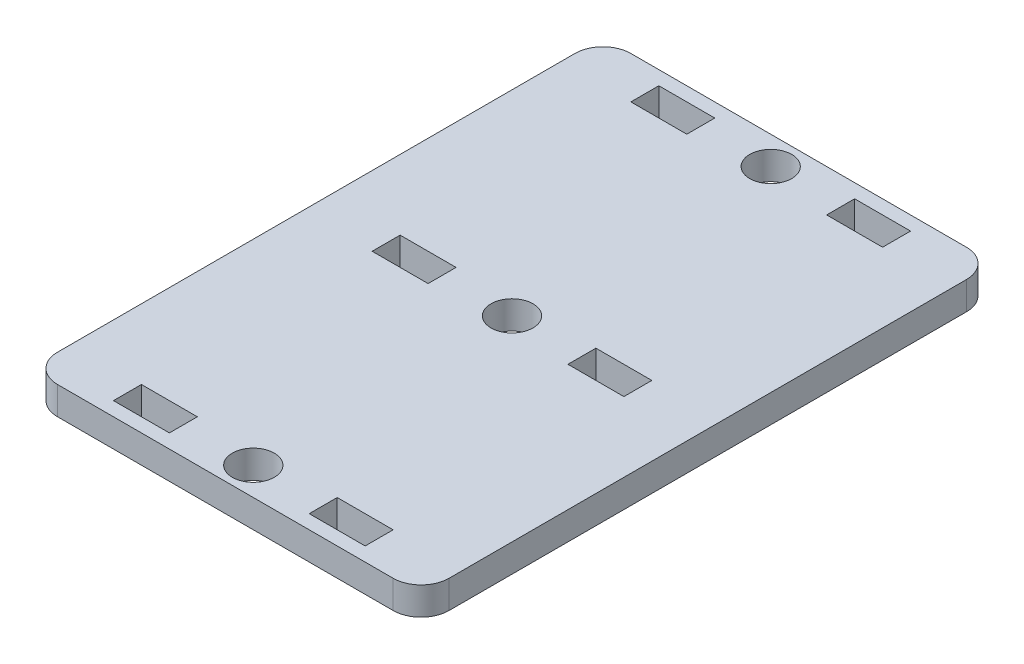
ISO-10303-21;
HEADER;
FILE_DESCRIPTION(('STEP AP214'),'2;1');
FILE_NAME('part.step','',(''),(''),'','','');
FILE_SCHEMA(('AUTOMOTIVE_DESIGN { 1 0 10303 214 1 1 1 1 }'));
ENDSEC;
DATA;
#1=APPLICATION_CONTEXT('core data for automotive mechanical design processes');
#2=APPLICATION_PROTOCOL_DEFINITION('international standard','automotive_design',2000,#1);
#3=PRODUCT_CONTEXT('',#1,'mechanical');
#4=PRODUCT('Part','Part','',(#3));
#5=PRODUCT_RELATED_PRODUCT_CATEGORY('part','',(#4));
#6=PRODUCT_DEFINITION_FORMATION('','',#4);
#7=PRODUCT_DEFINITION_CONTEXT('part definition',#1,'design');
#8=PRODUCT_DEFINITION('design','',#6,#7);
#9=PRODUCT_DEFINITION_SHAPE('','',#8);
#10=(LENGTH_UNIT() NAMED_UNIT(*) SI_UNIT(.MILLI.,.METRE.));
#11=(NAMED_UNIT(*) PLANE_ANGLE_UNIT() SI_UNIT($,.RADIAN.));
#12=(NAMED_UNIT(*) SI_UNIT($,.STERADIAN.) SOLID_ANGLE_UNIT());
#13=UNCERTAINTY_MEASURE_WITH_UNIT(LENGTH_MEASURE(1.E-05),#10,'distance_accuracy_value','');
#14=(GEOMETRIC_REPRESENTATION_CONTEXT(3) GLOBAL_UNCERTAINTY_ASSIGNED_CONTEXT((#13)) GLOBAL_UNIT_ASSIGNED_CONTEXT((#10,
#11,#12)) REPRESENTATION_CONTEXT('',''));
#15=CARTESIAN_POINT('',(0.,0.,0.));
#16=DIRECTION('',(0.,0.,1.));
#17=DIRECTION('',(1.,0.,0.));
#18=AXIS2_PLACEMENT_3D('',#15,#16,#17);
#19=CARTESIAN_POINT('',(0.,2.,0.));
#20=DIRECTION('',(0.,-1.,0.));
#21=DIRECTION('',(0.,0.,-1.));
#22=AXIS2_PLACEMENT_3D('',#19,#20,#21);
#23=PLANE('',#22);
#24=DIRECTION('',(0.,0.,1.));
#25=VECTOR('',#24,1.);
#26=CARTESIAN_POINT('',(42.5000000000015,2.,-9.25));
#27=LINE('',#26,#25);
#28=CARTESIAN_POINT('',(42.5000000000015,2.,-11.25));
#29=VERTEX_POINT('',#28);
#30=CARTESIAN_POINT('',(42.5000000000015,2.,-9.25));
#31=VERTEX_POINT('',#30);
#32=EDGE_CURVE('E402',#29,#31,#27,.T.);
#33=ORIENTED_EDGE('',*,*,#32,.F.);
#34=DIRECTION('',(-1.,0.,0.));
#35=VECTOR('',#34,1.);
#36=CARTESIAN_POINT('',(42.5000000000015,2.,-11.25));
#37=LINE('',#36,#35);
#38=CARTESIAN_POINT('',(46.5000000000015,2.,-11.25));
#39=VERTEX_POINT('',#38);
#40=EDGE_CURVE('E48',#39,#29,#37,.T.);
#41=ORIENTED_EDGE('',*,*,#40,.F.);
#42=DIRECTION('',(0.,0.,-1.));
#43=VECTOR('',#42,1.);
#44=CARTESIAN_POINT('',(46.5000000000015,2.,-9.25));
#45=LINE('',#44,#43);
#46=CARTESIAN_POINT('',(46.5000000000015,2.,-9.25));
#47=VERTEX_POINT('',#46);
#48=EDGE_CURVE('E391',#47,#39,#45,.T.);
#49=ORIENTED_EDGE('',*,*,#48,.F.);
#50=DIRECTION('',(1.,0.,0.));
#51=VECTOR('',#50,1.);
#52=CARTESIAN_POINT('',(42.5000000000015,2.,-9.25));
#53=LINE('',#52,#51);
#54=EDGE_CURVE('E405',#31,#47,#53,.T.);
#55=ORIENTED_EDGE('',*,*,#54,.F.);
#56=EDGE_LOOP('',(#33,#41,#49,#55));
#57=FACE_BOUND('',#56,.T.);
#58=DIRECTION('',(1.,0.,0.));
#59=VECTOR('',#58,1.);
#60=CARTESIAN_POINT('',(60.5,2.,-27.75));
#61=LINE('',#60,#59);
#62=CARTESIAN_POINT('',(56.5,2.,-27.75));
#63=VERTEX_POINT('',#62);
#64=CARTESIAN_POINT('',(60.5,2.,-27.75));
#65=VERTEX_POINT('',#64);
#66=EDGE_CURVE('E370',#63,#65,#61,.T.);
#67=ORIENTED_EDGE('',*,*,#66,.F.);
#68=DIRECTION('',(0.,0.,1.));
#69=VECTOR('',#68,1.);
#70=CARTESIAN_POINT('',(56.5,2.,-27.75));
#71=LINE('',#70,#69);
#72=CARTESIAN_POINT('',(56.5,2.,-29.75));
#73=VERTEX_POINT('',#72);
#74=EDGE_CURVE('E56',#73,#63,#71,.T.);
#75=ORIENTED_EDGE('',*,*,#74,.F.);
#76=DIRECTION('',(-1.,0.,0.));
#77=VECTOR('',#76,1.);
#78=CARTESIAN_POINT('',(60.5,2.,-29.75));
#79=LINE('',#78,#77);
#80=CARTESIAN_POINT('',(60.5,2.,-29.75));
#81=VERTEX_POINT('',#80);
#82=EDGE_CURVE('E359',#81,#73,#79,.T.);
#83=ORIENTED_EDGE('',*,*,#82,.F.);
#84=DIRECTION('',(0.,0.,-1.));
#85=VECTOR('',#84,1.);
#86=CARTESIAN_POINT('',(60.5,2.,-27.75));
#87=LINE('',#86,#85);
#88=EDGE_CURVE('E374',#65,#81,#87,.T.);
#89=ORIENTED_EDGE('',*,*,#88,.F.);
#90=EDGE_LOOP('',(#67,#75,#83,#89));
#91=FACE_BOUND('',#90,.T.);
#92=DIRECTION('',(-1.,0.,0.));
#93=VECTOR('',#92,1.);
#94=CARTESIAN_POINT('',(42.5,2.,-29.75));
#95=LINE('',#94,#93);
#96=CARTESIAN_POINT('',(46.5,2.,-29.75));
#97=VERTEX_POINT('',#96);
#98=CARTESIAN_POINT('',(42.5,2.,-29.75));
#99=VERTEX_POINT('',#98);
#100=EDGE_CURVE('E439',#97,#99,#95,.T.);
#101=ORIENTED_EDGE('',*,*,#100,.F.);
#102=DIRECTION('',(0.,0.,-1.));
#103=VECTOR('',#102,1.);
#104=CARTESIAN_POINT('',(46.5,2.,-27.75));
#105=LINE('',#104,#103);
#106=CARTESIAN_POINT('',(46.5,2.,-27.75));
#107=VERTEX_POINT('',#106);
#108=EDGE_CURVE('E381',#107,#97,#105,.T.);
#109=ORIENTED_EDGE('',*,*,#108,.F.);
#110=DIRECTION('',(1.,0.,0.));
#111=VECTOR('',#110,1.);
#112=CARTESIAN_POINT('',(42.5,2.,-27.75));
#113=LINE('',#112,#111);
#114=CARTESIAN_POINT('',(42.5,2.,-27.75));
#115=VERTEX_POINT('',#114);
#116=EDGE_CURVE('E428',#115,#107,#113,.T.);
#117=ORIENTED_EDGE('',*,*,#116,.F.);
#118=DIRECTION('',(0.,0.,1.));
#119=VECTOR('',#118,1.);
#120=CARTESIAN_POINT('',(42.5,2.,-27.75));
#121=LINE('',#120,#119);
#122=EDGE_CURVE('E442',#99,#115,#121,.T.);
#123=ORIENTED_EDGE('',*,*,#122,.F.);
#124=EDGE_LOOP('',(#101,#109,#117,#123));
#125=FACE_BOUND('',#124,.T.);
#126=CARTESIAN_POINT('',(51.500000000003,2.,8.25));
#127=DIRECTION('',(0.,1.,0.));
#128=DIRECTION('',(0.,0.,1.));
#129=AXIS2_PLACEMENT_3D('',#126,#127,#128);
#130=CIRCLE('',#129,1.5);
#131=CARTESIAN_POINT('',(51.500000000003,2.,9.75000000000001));
#132=VERTEX_POINT('',#131);
#133=EDGE_CURVE('E420',#132,#132,#130,.T.);
#134=ORIENTED_EDGE('',*,*,#133,.F.);
#135=EDGE_LOOP('',(#134));
#136=FACE_BOUND('',#135,.T.);
#137=CARTESIAN_POINT('',(51.5,2.,-28.75));
#138=DIRECTION('',(0.,1.,0.));
#139=DIRECTION('',(0.,0.,1.));
#140=AXIS2_PLACEMENT_3D('',#137,#138,#139);
#141=CIRCLE('',#140,1.5);
#142=CARTESIAN_POINT('',(51.5,2.,-27.25));
#143=VERTEX_POINT('',#142);
#144=EDGE_CURVE('E289',#143,#143,#141,.T.);
#145=ORIENTED_EDGE('',*,*,#144,.F.);
#146=EDGE_LOOP('',(#145));
#147=FACE_BOUND('',#146,.T.);
#148=DIRECTION('',(0.,0.,1.));
#149=VECTOR('',#148,1.);
#150=CARTESIAN_POINT('',(56.500000000003,2.,9.25));
#151=LINE('',#150,#149);
#152=CARTESIAN_POINT('',(56.500000000003,2.,7.25));
#153=VERTEX_POINT('',#152);
#154=CARTESIAN_POINT('',(56.500000000003,2.,9.25));
#155=VERTEX_POINT('',#154);
#156=EDGE_CURVE('E276',#153,#155,#151,.T.);
#157=ORIENTED_EDGE('',*,*,#156,.F.);
#158=DIRECTION('',(-1.,0.,0.));
#159=VECTOR('',#158,1.);
#160=CARTESIAN_POINT('',(60.500000000003,2.,7.25));
#161=LINE('',#160,#159);
#162=CARTESIAN_POINT('',(60.500000000003,2.,7.25));
#163=VERTEX_POINT('',#162);
#164=EDGE_CURVE('E249',#163,#153,#161,.T.);
#165=ORIENTED_EDGE('',*,*,#164,.F.);
#166=DIRECTION('',(0.,0.,-1.));
#167=VECTOR('',#166,1.);
#168=CARTESIAN_POINT('',(60.500000000003,2.,9.25));
#169=LINE('',#168,#167);
#170=CARTESIAN_POINT('',(60.500000000003,2.,9.25));
#171=VERTEX_POINT('',#170);
#172=EDGE_CURVE('E267',#171,#163,#169,.T.);
#173=ORIENTED_EDGE('',*,*,#172,.F.);
#174=DIRECTION('',(1.,0.,0.));
#175=VECTOR('',#174,1.);
#176=CARTESIAN_POINT('',(60.500000000003,2.,9.25));
#177=LINE('',#176,#175);
#178=EDGE_CURVE('E270',#155,#171,#177,.T.);
#179=ORIENTED_EDGE('',*,*,#178,.F.);
#180=EDGE_LOOP('',(#157,#165,#173,#179));
#181=FACE_BOUND('',#180,.T.);
#182=DIRECTION('',(0.,0.,1.));
#183=VECTOR('',#182,1.);
#184=CARTESIAN_POINT('',(42.500000000003,2.,9.25));
#185=LINE('',#184,#183);
#186=CARTESIAN_POINT('',(42.500000000003,2.,7.25));
#187=VERTEX_POINT('',#186);
#188=CARTESIAN_POINT('',(42.500000000003,2.,9.25));
#189=VERTEX_POINT('',#188);
#190=EDGE_CURVE('E340',#187,#189,#185,.T.);
#191=ORIENTED_EDGE('',*,*,#190,.F.);
#192=DIRECTION('',(-1.,0.,0.));
#193=VECTOR('',#192,1.);
#194=CARTESIAN_POINT('',(42.500000000003,2.,7.25));
#195=LINE('',#194,#193);
#196=CARTESIAN_POINT('',(46.500000000003,2.,7.25));
#197=VERTEX_POINT('',#196);
#198=EDGE_CURVE('E283',#197,#187,#195,.T.);
#199=ORIENTED_EDGE('',*,*,#198,.F.);
#200=DIRECTION('',(0.,0.,-1.));
#201=VECTOR('',#200,1.);
#202=CARTESIAN_POINT('',(46.500000000003,2.,9.25));
#203=LINE('',#202,#201);
#204=CARTESIAN_POINT('',(46.500000000003,2.,9.25));
#205=VERTEX_POINT('',#204);
#206=EDGE_CURVE('E329',#205,#197,#203,.T.);
#207=ORIENTED_EDGE('',*,*,#206,.F.);
#208=DIRECTION('',(1.,0.,0.));
#209=VECTOR('',#208,1.);
#210=CARTESIAN_POINT('',(42.500000000003,2.,9.25));
#211=LINE('',#210,#209);
#212=EDGE_CURVE('E343',#189,#205,#211,.T.);
#213=ORIENTED_EDGE('',*,*,#212,.F.);
#214=EDGE_LOOP('',(#191,#199,#207,#213));
#215=FACE_BOUND('',#214,.T.);
#216=DIRECTION('',(0.,0.,1.));
#217=VECTOR('',#216,1.);
#218=CARTESIAN_POINT('',(56.5000000000015,2.,-9.25));
#219=LINE('',#218,#217);
#220=CARTESIAN_POINT('',(56.5000000000015,2.,-11.25));
#221=VERTEX_POINT('',#220);
#222=CARTESIAN_POINT('',(56.5000000000015,2.,-9.25));
#223=VERTEX_POINT('',#222);
#224=EDGE_CURVE('E308',#221,#223,#219,.T.);
#225=ORIENTED_EDGE('',*,*,#224,.F.);
#226=DIRECTION('',(-1.,0.,0.));
#227=VECTOR('',#226,1.);
#228=CARTESIAN_POINT('',(60.5000000000015,2.,-11.25));
#229=LINE('',#228,#227);
#230=CARTESIAN_POINT('',(60.5000000000015,2.,-11.25));
#231=VERTEX_POINT('',#230);
#232=EDGE_CURVE('E306',#231,#221,#229,.T.);
#233=ORIENTED_EDGE('',*,*,#232,.F.);
#234=DIRECTION('',(0.,0.,-1.));
#235=VECTOR('',#234,1.);
#236=CARTESIAN_POINT('',(60.5000000000015,2.,-9.25));
#237=LINE('',#236,#235);
#238=CARTESIAN_POINT('',(60.5000000000015,2.,-9.25));
#239=VERTEX_POINT('',#238);
#240=EDGE_CURVE('E296',#239,#231,#237,.T.);
#241=ORIENTED_EDGE('',*,*,#240,.F.);
#242=DIRECTION('',(1.,0.,0.));
#243=VECTOR('',#242,1.);
#244=CARTESIAN_POINT('',(60.5000000000015,2.,-9.25));
#245=LINE('',#244,#243);
#246=EDGE_CURVE('E312',#223,#239,#245,.T.);
#247=ORIENTED_EDGE('',*,*,#246,.F.);
#248=EDGE_LOOP('',(#225,#233,#241,#247));
#249=FACE_BOUND('',#248,.T.);
#250=CARTESIAN_POINT('',(51.5000000000015,2.,-10.25));
#251=DIRECTION('',(0.,1.,0.));
#252=DIRECTION('',(0.,0.,1.));
#253=AXIS2_PLACEMENT_3D('',#250,#251,#252);
#254=CIRCLE('',#253,1.5);
#255=CARTESIAN_POINT('',(51.5000000000015,2.,-8.74999999999999));
#256=VERTEX_POINT('',#255);
#257=EDGE_CURVE('E419',#256,#256,#254,.T.);
#258=ORIENTED_EDGE('',*,*,#257,.F.);
#259=EDGE_LOOP('',(#258));
#260=FACE_BOUND('',#259,.T.);
#261=DIRECTION('',(0.,0.,1.));
#262=VECTOR('',#261,1.);
#263=CARTESIAN_POINT('',(37.5,2.,-20.5));
#264=LINE('',#263,#262);
#265=CARTESIAN_POINT('',(37.5,2.,-28.75));
#266=VERTEX_POINT('',#265);
#267=CARTESIAN_POINT('',(37.5,2.,8.25));
#268=VERTEX_POINT('',#267);
#269=EDGE_CURVE('E470',#266,#268,#264,.T.);
#270=ORIENTED_EDGE('',*,*,#269,.T.);
#271=CARTESIAN_POINT('',(39.5,2.,8.25));
#272=DIRECTION('',(0.,-1.,0.));
#273=DIRECTION('',(0.,0.,-1.));
#274=AXIS2_PLACEMENT_3D('',#271,#272,#273);
#275=CIRCLE('',#274,2.);
#276=CARTESIAN_POINT('',(39.5,2.,10.25));
#277=VERTEX_POINT('',#276);
#278=EDGE_CURVE('E498',#268,#277,#275,.F.);
#279=ORIENTED_EDGE('',*,*,#278,.T.);
#280=DIRECTION('',(1.,0.,0.));
#281=VECTOR('',#280,1.);
#282=CARTESIAN_POINT('',(65.5,2.,10.25));
#283=LINE('',#282,#281);
#284=CARTESIAN_POINT('',(63.5,2.,10.25));
#285=VERTEX_POINT('',#284);
#286=EDGE_CURVE('E460',#277,#285,#283,.T.);
#287=ORIENTED_EDGE('',*,*,#286,.T.);
#288=CARTESIAN_POINT('',(63.5,2.,8.24999999999999));
#289=DIRECTION('',(0.,-1.,0.));
#290=DIRECTION('',(0.,0.,-1.));
#291=AXIS2_PLACEMENT_3D('',#288,#289,#290);
#292=CIRCLE('',#291,2.);
#293=CARTESIAN_POINT('',(65.5,2.,8.24999999999999));
#294=VERTEX_POINT('',#293);
#295=EDGE_CURVE('E500',#285,#294,#292,.F.);
#296=ORIENTED_EDGE('',*,*,#295,.T.);
#297=DIRECTION('',(0.,0.,-1.));
#298=VECTOR('',#297,1.);
#299=CARTESIAN_POINT('',(65.5,2.,0.749999999999999));
#300=LINE('',#299,#298);
#301=CARTESIAN_POINT('',(65.5,2.,-28.75));
#302=VERTEX_POINT('',#301);
#303=EDGE_CURVE('E463',#294,#302,#300,.T.);
#304=ORIENTED_EDGE('',*,*,#303,.T.);
#305=CARTESIAN_POINT('',(63.5,2.,-28.75));
#306=DIRECTION('',(0.,-1.,0.));
#307=DIRECTION('',(0.,0.,-1.));
#308=AXIS2_PLACEMENT_3D('',#305,#306,#307);
#309=CIRCLE('',#308,2.);
#310=CARTESIAN_POINT('',(63.5,2.,-30.75));
#311=VERTEX_POINT('',#310);
#312=EDGE_CURVE('E502',#302,#311,#309,.F.);
#313=ORIENTED_EDGE('',*,*,#312,.T.);
#314=DIRECTION('',(-1.,0.,0.));
#315=VECTOR('',#314,1.);
#316=CARTESIAN_POINT('',(65.5,2.,-30.75));
#317=LINE('',#316,#315);
#318=CARTESIAN_POINT('',(39.5,2.,-30.75));
#319=VERTEX_POINT('',#318);
#320=EDGE_CURVE('E467',#311,#319,#317,.T.);
#321=ORIENTED_EDGE('',*,*,#320,.T.);
#322=CARTESIAN_POINT('',(39.5,2.,-28.75));
#323=DIRECTION('',(0.,-1.,0.));
#324=DIRECTION('',(0.,0.,-1.));
#325=AXIS2_PLACEMENT_3D('',#322,#323,#324);
#326=CIRCLE('',#325,2.);
#327=EDGE_CURVE('E504',#319,#266,#326,.F.);
#328=ORIENTED_EDGE('',*,*,#327,.T.);
#329=EDGE_LOOP('',(#270,#279,#287,#296,#304,#313,#321,#328));
#330=FACE_BOUND('',#329,.T.);
#331=ADVANCED_FACE('F33',(#57,#91,#125,#136,#147,#181,#215,#249,#260,#330),#23,.F.);
#332=CARTESIAN_POINT('',(0.,0.,0.));
#333=DIRECTION('',(0.,-1.,0.));
#334=DIRECTION('',(0.,0.,-1.));
#335=AXIS2_PLACEMENT_3D('',#332,#333,#334);
#336=PLANE('',#335);
#337=CARTESIAN_POINT('',(39.5,0.,8.25));
#338=DIRECTION('',(0.,-1.,0.));
#339=DIRECTION('',(0.,0.,-1.));
#340=AXIS2_PLACEMENT_3D('',#337,#338,#339);
#341=CIRCLE('',#340,2.);
#342=CARTESIAN_POINT('',(39.5,0.,10.25));
#343=VERTEX_POINT('',#342);
#344=CARTESIAN_POINT('',(37.5,0.,8.25));
#345=VERTEX_POINT('',#344);
#346=EDGE_CURVE('E484',#343,#345,#341,.T.);
#347=ORIENTED_EDGE('',*,*,#346,.T.);
#348=DIRECTION('',(0.,0.,1.));
#349=VECTOR('',#348,1.);
#350=CARTESIAN_POINT('',(37.5,0.,-20.5));
#351=LINE('',#350,#349);
#352=CARTESIAN_POINT('',(37.5,0.,-28.75));
#353=VERTEX_POINT('',#352);
#354=EDGE_CURVE('E464',#353,#345,#351,.T.);
#355=ORIENTED_EDGE('',*,*,#354,.F.);
#356=CARTESIAN_POINT('',(39.5,0.,-28.75));
#357=DIRECTION('',(0.,-1.,0.));
#358=DIRECTION('',(0.,0.,-1.));
#359=AXIS2_PLACEMENT_3D('',#356,#357,#358);
#360=CIRCLE('',#359,2.);
#361=CARTESIAN_POINT('',(39.5,0.,-30.75));
#362=VERTEX_POINT('',#361);
#363=EDGE_CURVE('E491',#353,#362,#360,.T.);
#364=ORIENTED_EDGE('',*,*,#363,.T.);
#365=DIRECTION('',(-1.,0.,0.));
#366=VECTOR('',#365,1.);
#367=CARTESIAN_POINT('',(65.5,0.,-30.75));
#368=LINE('',#367,#366);
#369=CARTESIAN_POINT('',(63.5,0.,-30.75));
#370=VERTEX_POINT('',#369);
#371=EDGE_CURVE('E478',#370,#362,#368,.T.);
#372=ORIENTED_EDGE('',*,*,#371,.F.);
#373=CARTESIAN_POINT('',(63.5,0.,-28.75));
#374=DIRECTION('',(0.,-1.,0.));
#375=DIRECTION('',(0.,0.,-1.));
#376=AXIS2_PLACEMENT_3D('',#373,#374,#375);
#377=CIRCLE('',#376,2.);
#378=CARTESIAN_POINT('',(65.5,0.,-28.75));
#379=VERTEX_POINT('',#378);
#380=EDGE_CURVE('E489',#370,#379,#377,.T.);
#381=ORIENTED_EDGE('',*,*,#380,.T.);
#382=DIRECTION('',(0.,0.,-1.));
#383=VECTOR('',#382,1.);
#384=CARTESIAN_POINT('',(65.5,0.,-21.25));
#385=LINE('',#384,#383);
#386=CARTESIAN_POINT('',(65.5,0.,8.24999999999999));
#387=VERTEX_POINT('',#386);
#388=EDGE_CURVE('E475',#387,#379,#385,.T.);
#389=ORIENTED_EDGE('',*,*,#388,.F.);
#390=CARTESIAN_POINT('',(63.5,0.,8.24999999999999));
#391=DIRECTION('',(0.,-1.,0.));
#392=DIRECTION('',(0.,0.,-1.));
#393=AXIS2_PLACEMENT_3D('',#390,#391,#392);
#394=CIRCLE('',#393,2.);
#395=CARTESIAN_POINT('',(63.5,0.,10.25));
#396=VERTEX_POINT('',#395);
#397=EDGE_CURVE('E487',#387,#396,#394,.T.);
#398=ORIENTED_EDGE('',*,*,#397,.T.);
#399=DIRECTION('',(1.,0.,0.));
#400=VECTOR('',#399,1.);
#401=CARTESIAN_POINT('',(65.5,0.,10.25));
#402=LINE('',#401,#400);
#403=EDGE_CURVE('E457',#343,#396,#402,.T.);
#404=ORIENTED_EDGE('',*,*,#403,.F.);
#405=EDGE_LOOP('',(#347,#355,#364,#372,#381,#389,#398,#404));
#406=FACE_BOUND('',#405,.T.);
#407=DIRECTION('',(-1.,0.,0.));
#408=VECTOR('',#407,1.);
#409=CARTESIAN_POINT('',(42.5000000000015,0.,-11.25));
#410=LINE('',#409,#408);
#411=CARTESIAN_POINT('',(46.5000000000015,0.,-11.25));
#412=VERTEX_POINT('',#411);
#413=CARTESIAN_POINT('',(42.5000000000015,0.,-11.25));
#414=VERTEX_POINT('',#413);
#415=EDGE_CURVE('E387',#412,#414,#410,.T.);
#416=ORIENTED_EDGE('',*,*,#415,.T.);
#417=DIRECTION('',(0.,0.,1.));
#418=VECTOR('',#417,1.);
#419=CARTESIAN_POINT('',(42.5000000000015,0.,-9.25));
#420=LINE('',#419,#418);
#421=CARTESIAN_POINT('',(42.5000000000015,0.,-9.25));
#422=VERTEX_POINT('',#421);
#423=EDGE_CURVE('E390',#414,#422,#420,.T.);
#424=ORIENTED_EDGE('',*,*,#423,.T.);
#425=DIRECTION('',(1.,0.,0.));
#426=VECTOR('',#425,1.);
#427=CARTESIAN_POINT('',(42.5000000000015,0.,-9.25));
#428=LINE('',#427,#426);
#429=CARTESIAN_POINT('',(46.5000000000015,0.,-9.25));
#430=VERTEX_POINT('',#429);
#431=EDGE_CURVE('E394',#422,#430,#428,.T.);
#432=ORIENTED_EDGE('',*,*,#431,.T.);
#433=DIRECTION('',(0.,0.,-1.));
#434=VECTOR('',#433,1.);
#435=CARTESIAN_POINT('',(46.5000000000015,0.,-9.25));
#436=LINE('',#435,#434);
#437=EDGE_CURVE('E397',#430,#412,#436,.T.);
#438=ORIENTED_EDGE('',*,*,#437,.T.);
#439=EDGE_LOOP('',(#416,#424,#432,#438));
#440=FACE_BOUND('',#439,.T.);
#441=DIRECTION('',(0.,0.,1.));
#442=VECTOR('',#441,1.);
#443=CARTESIAN_POINT('',(56.5,0.,-27.75));
#444=LINE('',#443,#442);
#445=CARTESIAN_POINT('',(56.5,0.,-29.75));
#446=VERTEX_POINT('',#445);
#447=CARTESIAN_POINT('',(56.5,0.,-27.75));
#448=VERTEX_POINT('',#447);
#449=EDGE_CURVE('E355',#446,#448,#444,.T.);
#450=ORIENTED_EDGE('',*,*,#449,.T.);
#451=DIRECTION('',(1.,0.,0.));
#452=VECTOR('',#451,1.);
#453=CARTESIAN_POINT('',(60.5,0.,-27.75));
#454=LINE('',#453,#452);
#455=CARTESIAN_POINT('',(60.5,0.,-27.75));
#456=VERTEX_POINT('',#455);
#457=EDGE_CURVE('E358',#448,#456,#454,.T.);
#458=ORIENTED_EDGE('',*,*,#457,.T.);
#459=DIRECTION('',(0.,0.,-1.));
#460=VECTOR('',#459,1.);
#461=CARTESIAN_POINT('',(60.5,0.,-27.75));
#462=LINE('',#461,#460);
#463=CARTESIAN_POINT('',(60.5,0.,-29.75));
#464=VERTEX_POINT('',#463);
#465=EDGE_CURVE('E362',#456,#464,#462,.T.);
#466=ORIENTED_EDGE('',*,*,#465,.T.);
#467=DIRECTION('',(-1.,0.,0.));
#468=VECTOR('',#467,1.);
#469=CARTESIAN_POINT('',(60.5,0.,-29.75));
#470=LINE('',#469,#468);
#471=EDGE_CURVE('E365',#464,#446,#470,.T.);
#472=ORIENTED_EDGE('',*,*,#471,.T.);
#473=EDGE_LOOP('',(#450,#458,#466,#472));
#474=FACE_BOUND('',#473,.T.);
#475=DIRECTION('',(0.,0.,-1.));
#476=VECTOR('',#475,1.);
#477=CARTESIAN_POINT('',(46.5,0.,-27.75));
#478=LINE('',#477,#476);
#479=CARTESIAN_POINT('',(46.5,0.,-27.75));
#480=VERTEX_POINT('',#479);
#481=CARTESIAN_POINT('',(46.5,0.,-29.75));
#482=VERTEX_POINT('',#481);
#483=EDGE_CURVE('E424',#480,#482,#478,.T.);
#484=ORIENTED_EDGE('',*,*,#483,.T.);
#485=DIRECTION('',(-1.,0.,0.));
#486=VECTOR('',#485,1.);
#487=CARTESIAN_POINT('',(42.5,0.,-29.75));
#488=LINE('',#487,#486);
#489=CARTESIAN_POINT('',(42.5,0.,-29.75));
#490=VERTEX_POINT('',#489);
#491=EDGE_CURVE('E427',#482,#490,#488,.T.);
#492=ORIENTED_EDGE('',*,*,#491,.T.);
#493=DIRECTION('',(0.,0.,1.));
#494=VECTOR('',#493,1.);
#495=CARTESIAN_POINT('',(42.5,0.,-27.75));
#496=LINE('',#495,#494);
#497=CARTESIAN_POINT('',(42.5,0.,-27.75));
#498=VERTEX_POINT('',#497);
#499=EDGE_CURVE('E431',#490,#498,#496,.T.);
#500=ORIENTED_EDGE('',*,*,#499,.T.);
#501=DIRECTION('',(1.,0.,0.));
#502=VECTOR('',#501,1.);
#503=CARTESIAN_POINT('',(42.5,0.,-27.75));
#504=LINE('',#503,#502);
#505=EDGE_CURVE('E434',#498,#480,#504,.T.);
#506=ORIENTED_EDGE('',*,*,#505,.T.);
#507=EDGE_LOOP('',(#484,#492,#500,#506));
#508=FACE_BOUND('',#507,.T.);
#509=CARTESIAN_POINT('',(51.500000000003,0.,8.25));
#510=DIRECTION('',(0.,1.,0.));
#511=DIRECTION('',(0.,0.,1.));
#512=AXIS2_PLACEMENT_3D('',#509,#510,#511);
#513=CIRCLE('',#512,1.5);
#514=CARTESIAN_POINT('',(51.500000000003,0.,9.75000000000001));
#515=VERTEX_POINT('',#514);
#516=EDGE_CURVE('E416',#515,#515,#513,.T.);
#517=ORIENTED_EDGE('',*,*,#516,.T.);
#518=EDGE_LOOP('',(#517));
#519=FACE_BOUND('',#518,.T.);
#520=CARTESIAN_POINT('',(51.5,0.,-28.75));
#521=DIRECTION('',(0.,1.,0.));
#522=DIRECTION('',(0.,0.,1.));
#523=AXIS2_PLACEMENT_3D('',#520,#521,#522);
#524=CIRCLE('',#523,1.5);
#525=CARTESIAN_POINT('',(51.5,0.,-27.25));
#526=VERTEX_POINT('',#525);
#527=EDGE_CURVE('E277',#526,#526,#524,.T.);
#528=ORIENTED_EDGE('',*,*,#527,.T.);
#529=EDGE_LOOP('',(#528));
#530=FACE_BOUND('',#529,.T.);
#531=DIRECTION('',(-1.,0.,0.));
#532=VECTOR('',#531,1.);
#533=CARTESIAN_POINT('',(60.500000000003,0.,7.25));
#534=LINE('',#533,#532);
#535=CARTESIAN_POINT('',(60.500000000003,0.,7.25));
#536=VERTEX_POINT('',#535);
#537=CARTESIAN_POINT('',(56.500000000003,0.,7.25));
#538=VERTEX_POINT('',#537);
#539=EDGE_CURVE('E246',#536,#538,#534,.T.);
#540=ORIENTED_EDGE('',*,*,#539,.T.);
#541=DIRECTION('',(0.,0.,1.));
#542=VECTOR('',#541,1.);
#543=CARTESIAN_POINT('',(56.500000000003,0.,9.25));
#544=LINE('',#543,#542);
#545=CARTESIAN_POINT('',(56.500000000003,0.,9.25));
#546=VERTEX_POINT('',#545);
#547=EDGE_CURVE('E258',#538,#546,#544,.T.);
#548=ORIENTED_EDGE('',*,*,#547,.T.);
#549=DIRECTION('',(1.,0.,0.));
#550=VECTOR('',#549,1.);
#551=CARTESIAN_POINT('',(60.500000000003,0.,9.25));
#552=LINE('',#551,#550);
#553=CARTESIAN_POINT('',(60.500000000003,0.,9.25));
#554=VERTEX_POINT('',#553);
#555=EDGE_CURVE('E262',#546,#554,#552,.T.);
#556=ORIENTED_EDGE('',*,*,#555,.T.);
#557=DIRECTION('',(0.,0.,-1.));
#558=VECTOR('',#557,1.);
#559=CARTESIAN_POINT('',(60.500000000003,0.,9.25));
#560=LINE('',#559,#558);
#561=EDGE_CURVE('E254',#554,#536,#560,.T.);
#562=ORIENTED_EDGE('',*,*,#561,.T.);
#563=EDGE_LOOP('',(#540,#548,#556,#562));
#564=FACE_BOUND('',#563,.T.);
#565=DIRECTION('',(-1.,0.,0.));
#566=VECTOR('',#565,1.);
#567=CARTESIAN_POINT('',(42.500000000003,0.,7.25));
#568=LINE('',#567,#566);
#569=CARTESIAN_POINT('',(46.500000000003,0.,7.25));
#570=VERTEX_POINT('',#569);
#571=CARTESIAN_POINT('',(42.500000000003,0.,7.25));
#572=VERTEX_POINT('',#571);
#573=EDGE_CURVE('E325',#570,#572,#568,.T.);
#574=ORIENTED_EDGE('',*,*,#573,.T.);
#575=DIRECTION('',(0.,0.,1.));
#576=VECTOR('',#575,1.);
#577=CARTESIAN_POINT('',(42.500000000003,0.,9.25));
#578=LINE('',#577,#576);
#579=CARTESIAN_POINT('',(42.500000000003,0.,9.25));
#580=VERTEX_POINT('',#579);
#581=EDGE_CURVE('E328',#572,#580,#578,.T.);
#582=ORIENTED_EDGE('',*,*,#581,.T.);
#583=DIRECTION('',(1.,0.,0.));
#584=VECTOR('',#583,1.);
#585=CARTESIAN_POINT('',(42.500000000003,0.,9.25));
#586=LINE('',#585,#584);
#587=CARTESIAN_POINT('',(46.500000000003,0.,9.25));
#588=VERTEX_POINT('',#587);
#589=EDGE_CURVE('E332',#580,#588,#586,.T.);
#590=ORIENTED_EDGE('',*,*,#589,.T.);
#591=DIRECTION('',(0.,0.,-1.));
#592=VECTOR('',#591,1.);
#593=CARTESIAN_POINT('',(46.500000000003,0.,9.25));
#594=LINE('',#593,#592);
#595=EDGE_CURVE('E335',#588,#570,#594,.T.);
#596=ORIENTED_EDGE('',*,*,#595,.T.);
#597=EDGE_LOOP('',(#574,#582,#590,#596));
#598=FACE_BOUND('',#597,.T.);
#599=DIRECTION('',(-1.,0.,0.));
#600=VECTOR('',#599,1.);
#601=CARTESIAN_POINT('',(60.5000000000015,0.,-11.25));
#602=LINE('',#601,#600);
#603=CARTESIAN_POINT('',(60.5000000000015,0.,-11.25));
#604=VERTEX_POINT('',#603);
#605=CARTESIAN_POINT('',(56.5000000000015,0.,-11.25));
#606=VERTEX_POINT('',#605);
#607=EDGE_CURVE('E292',#604,#606,#602,.T.);
#608=ORIENTED_EDGE('',*,*,#607,.T.);
#609=DIRECTION('',(0.,0.,1.));
#610=VECTOR('',#609,1.);
#611=CARTESIAN_POINT('',(56.5000000000015,0.,-9.25));
#612=LINE('',#611,#610);
#613=CARTESIAN_POINT('',(56.5000000000015,0.,-9.25));
#614=VERTEX_POINT('',#613);
#615=EDGE_CURVE('E295',#606,#614,#612,.T.);
#616=ORIENTED_EDGE('',*,*,#615,.T.);
#617=DIRECTION('',(1.,0.,0.));
#618=VECTOR('',#617,1.);
#619=CARTESIAN_POINT('',(60.5000000000015,0.,-9.25));
#620=LINE('',#619,#618);
#621=CARTESIAN_POINT('',(60.5000000000015,0.,-9.25));
#622=VERTEX_POINT('',#621);
#623=EDGE_CURVE('E299',#614,#622,#620,.T.);
#624=ORIENTED_EDGE('',*,*,#623,.T.);
#625=DIRECTION('',(0.,0.,-1.));
#626=VECTOR('',#625,1.);
#627=CARTESIAN_POINT('',(60.5000000000015,0.,-9.25));
#628=LINE('',#627,#626);
#629=EDGE_CURVE('E302',#622,#604,#628,.T.);
#630=ORIENTED_EDGE('',*,*,#629,.T.);
#631=EDGE_LOOP('',(#608,#616,#624,#630));
#632=FACE_BOUND('',#631,.T.);
#633=CARTESIAN_POINT('',(51.5000000000015,0.,-10.25));
#634=DIRECTION('',(0.,1.,0.));
#635=DIRECTION('',(0.,0.,1.));
#636=AXIS2_PLACEMENT_3D('',#633,#634,#635);
#637=CIRCLE('',#636,1.5);
#638=CARTESIAN_POINT('',(51.5000000000015,0.,-8.74999999999999));
#639=VERTEX_POINT('',#638);
#640=EDGE_CURVE('E454',#639,#639,#637,.T.);
#641=ORIENTED_EDGE('',*,*,#640,.T.);
#642=EDGE_LOOP('',(#641));
#643=FACE_BOUND('',#642,.T.);
#644=ADVANCED_FACE('F264',(#406,#440,#474,#508,#519,#530,#564,#598,#632,#643),#336,.T.);
#645=CARTESIAN_POINT('',(65.5,2.,10.25));
#646=DIRECTION('',(0.,0.,-1.));
#647=DIRECTION('',(-1.,0.,0.));
#648=AXIS2_PLACEMENT_3D('',#645,#646,#647);
#649=PLANE('',#648);
#650=ORIENTED_EDGE('',*,*,#403,.T.);
#651=DIRECTION('',(0.,-1.,0.));
#652=VECTOR('',#651,1.);
#653=CARTESIAN_POINT('',(63.5,2.,10.25));
#654=LINE('',#653,#652);
#655=EDGE_CURVE('E41',#396,#285,#654,.F.);
#656=ORIENTED_EDGE('',*,*,#655,.T.);
#657=ORIENTED_EDGE('',*,*,#286,.F.);
#658=DIRECTION('',(0.,-1.,0.));
#659=VECTOR('',#658,1.);
#660=CARTESIAN_POINT('',(39.5,2.,10.25));
#661=LINE('',#660,#659);
#662=EDGE_CURVE('E511',#277,#343,#661,.T.);
#663=ORIENTED_EDGE('',*,*,#662,.T.);
#664=EDGE_LOOP('',(#650,#656,#657,#663));
#665=FACE_BOUND('',#664,.T.);
#666=ADVANCED_FACE('F516',(#665),#649,.F.);
#667=CARTESIAN_POINT('',(65.5,2.,-21.25));
#668=DIRECTION('',(-1.,0.,0.));
#669=DIRECTION('',(0.,0.,1.));
#670=AXIS2_PLACEMENT_3D('',#667,#668,#669);
#671=PLANE('',#670);
#672=ORIENTED_EDGE('',*,*,#388,.T.);
#673=DIRECTION('',(0.,-1.,0.));
#674=VECTOR('',#673,1.);
#675=CARTESIAN_POINT('',(65.5,2.,-28.75));
#676=LINE('',#675,#674);
#677=EDGE_CURVE('E509',#379,#302,#676,.F.);
#678=ORIENTED_EDGE('',*,*,#677,.T.);
#679=ORIENTED_EDGE('',*,*,#303,.F.);
#680=DIRECTION('',(0.,-1.,0.));
#681=VECTOR('',#680,1.);
#682=CARTESIAN_POINT('',(65.5,2.,8.24999999999999));
#683=LINE('',#682,#681);
#684=EDGE_CURVE('E506',#294,#387,#683,.T.);
#685=ORIENTED_EDGE('',*,*,#684,.T.);
#686=EDGE_LOOP('',(#672,#678,#679,#685));
#687=FACE_BOUND('',#686,.T.);
#688=ADVANCED_FACE('F528',(#687),#671,.F.);
#689=CARTESIAN_POINT('',(65.5,2.,-30.75));
#690=DIRECTION('',(0.,0.,1.));
#691=DIRECTION('',(1.,0.,0.));
#692=AXIS2_PLACEMENT_3D('',#689,#690,#691);
#693=PLANE('',#692);
#694=ORIENTED_EDGE('',*,*,#371,.T.);
#695=DIRECTION('',(0.,-1.,0.));
#696=VECTOR('',#695,1.);
#697=CARTESIAN_POINT('',(39.5,2.,-30.75));
#698=LINE('',#697,#696);
#699=EDGE_CURVE('E496',#362,#319,#698,.F.);
#700=ORIENTED_EDGE('',*,*,#699,.T.);
#701=ORIENTED_EDGE('',*,*,#320,.F.);
#702=DIRECTION('',(0.,-1.,0.));
#703=VECTOR('',#702,1.);
#704=CARTESIAN_POINT('',(63.5,2.,-30.75));
#705=LINE('',#704,#703);
#706=EDGE_CURVE('E493',#311,#370,#705,.T.);
#707=ORIENTED_EDGE('',*,*,#706,.T.);
#708=EDGE_LOOP('',(#694,#700,#701,#707));
#709=FACE_BOUND('',#708,.T.);
#710=ADVANCED_FACE('F539',(#709),#693,.F.);
#711=CARTESIAN_POINT('',(37.5,2.,-20.5));
#712=DIRECTION('',(1.,0.,0.));
#713=DIRECTION('',(0.,0.,-1.));
#714=AXIS2_PLACEMENT_3D('',#711,#712,#713);
#715=PLANE('',#714);
#716=ORIENTED_EDGE('',*,*,#354,.T.);
#717=DIRECTION('',(0.,-1.,0.));
#718=VECTOR('',#717,1.);
#719=CARTESIAN_POINT('',(37.5,2.,8.25));
#720=LINE('',#719,#718);
#721=EDGE_CURVE('E11',#345,#268,#720,.F.);
#722=ORIENTED_EDGE('',*,*,#721,.T.);
#723=ORIENTED_EDGE('',*,*,#269,.F.);
#724=DIRECTION('',(0.,-1.,0.));
#725=VECTOR('',#724,1.);
#726=CARTESIAN_POINT('',(37.5,2.,-28.75));
#727=LINE('',#726,#725);
#728=EDGE_CURVE('E472',#266,#353,#727,.T.);
#729=ORIENTED_EDGE('',*,*,#728,.T.);
#730=EDGE_LOOP('',(#716,#722,#723,#729));
#731=FACE_BOUND('',#730,.T.);
#732=ADVANCED_FACE('F548',(#731),#715,.F.);
#733=CARTESIAN_POINT('',(39.5,2.,-28.75));
#734=DIRECTION('',(0.,-1.,0.));
#735=DIRECTION('',(0.,0.,-1.));
#736=AXIS2_PLACEMENT_3D('',#733,#734,#735);
#737=CYLINDRICAL_SURFACE('',#736,2.);
#738=ORIENTED_EDGE('',*,*,#327,.F.);
#739=ORIENTED_EDGE('',*,*,#699,.F.);
#740=ORIENTED_EDGE('',*,*,#363,.F.);
#741=ORIENTED_EDGE('',*,*,#728,.F.);
#742=EDGE_LOOP('',(#738,#739,#740,#741));
#743=FACE_BOUND('',#742,.T.);
#744=ADVANCED_FACE('F545',(#743),#737,.T.);
#745=CARTESIAN_POINT('',(63.5,2.,-28.75));
#746=DIRECTION('',(0.,-1.,0.));
#747=DIRECTION('',(0.,0.,-1.));
#748=AXIS2_PLACEMENT_3D('',#745,#746,#747);
#749=CYLINDRICAL_SURFACE('',#748,2.);
#750=ORIENTED_EDGE('',*,*,#312,.F.);
#751=ORIENTED_EDGE('',*,*,#677,.F.);
#752=ORIENTED_EDGE('',*,*,#380,.F.);
#753=ORIENTED_EDGE('',*,*,#706,.F.);
#754=EDGE_LOOP('',(#750,#751,#752,#753));
#755=FACE_BOUND('',#754,.T.);
#756=ADVANCED_FACE('F536',(#755),#749,.T.);
#757=CARTESIAN_POINT('',(63.5,2.,8.24999999999999));
#758=DIRECTION('',(0.,-1.,0.));
#759=DIRECTION('',(0.,0.,-1.));
#760=AXIS2_PLACEMENT_3D('',#757,#758,#759);
#761=CYLINDRICAL_SURFACE('',#760,2.);
#762=ORIENTED_EDGE('',*,*,#295,.F.);
#763=ORIENTED_EDGE('',*,*,#655,.F.);
#764=ORIENTED_EDGE('',*,*,#397,.F.);
#765=ORIENTED_EDGE('',*,*,#684,.F.);
#766=EDGE_LOOP('',(#762,#763,#764,#765));
#767=FACE_BOUND('',#766,.T.);
#768=ADVANCED_FACE('F525',(#767),#761,.T.);
#769=CARTESIAN_POINT('',(39.5,2.,8.25));
#770=DIRECTION('',(0.,-1.,0.));
#771=DIRECTION('',(0.,0.,-1.));
#772=AXIS2_PLACEMENT_3D('',#769,#770,#771);
#773=CYLINDRICAL_SURFACE('',#772,2.);
#774=ORIENTED_EDGE('',*,*,#278,.F.);
#775=ORIENTED_EDGE('',*,*,#721,.F.);
#776=ORIENTED_EDGE('',*,*,#346,.F.);
#777=ORIENTED_EDGE('',*,*,#662,.F.);
#778=EDGE_LOOP('',(#774,#775,#776,#777));
#779=FACE_BOUND('',#778,.T.);
#780=ADVANCED_FACE('F35',(#779),#773,.T.);
#781=CARTESIAN_POINT('',(51.5000000000015,0.,-10.25));
#782=DIRECTION('',(0.,1.,0.));
#783=DIRECTION('',(0.,0.,1.));
#784=AXIS2_PLACEMENT_3D('',#781,#782,#783);
#785=CYLINDRICAL_SURFACE('',#784,1.5);
#786=ORIENTED_EDGE('',*,*,#640,.F.);
#787=EDGE_LOOP('',(#786));
#788=FACE_BOUND('',#787,.T.);
#789=ORIENTED_EDGE('',*,*,#257,.T.);
#790=EDGE_LOOP('',(#789));
#791=FACE_BOUND('',#790,.T.);
#792=ADVANCED_FACE('F552',(#788,#791),#785,.F.);
#793=CARTESIAN_POINT('',(60.5000000000015,0.,-11.25));
#794=DIRECTION('',(0.,0.,-1.));
#795=DIRECTION('',(-1.,0.,0.));
#796=AXIS2_PLACEMENT_3D('',#793,#794,#795);
#797=PLANE('',#796);
#798=ORIENTED_EDGE('',*,*,#232,.T.);
#799=DIRECTION('',(0.,1.,0.));
#800=VECTOR('',#799,1.);
#801=CARTESIAN_POINT('',(56.5000000000015,0.,-11.25));
#802=LINE('',#801,#800);
#803=EDGE_CURVE('E305',#606,#221,#802,.T.);
#804=ORIENTED_EDGE('',*,*,#803,.F.);
#805=ORIENTED_EDGE('',*,*,#607,.F.);
#806=DIRECTION('',(0.,1.,0.));
#807=VECTOR('',#806,1.);
#808=CARTESIAN_POINT('',(60.5000000000015,0.,-11.25));
#809=LINE('',#808,#807);
#810=EDGE_CURVE('E317',#604,#231,#809,.T.);
#811=ORIENTED_EDGE('',*,*,#810,.T.);
#812=EDGE_LOOP('',(#798,#804,#805,#811));
#813=FACE_BOUND('',#812,.T.);
#814=ADVANCED_FACE('F557',(#813),#797,.F.);
#815=CARTESIAN_POINT('',(60.5000000000015,0.,-9.25));
#816=DIRECTION('',(1.,0.,0.));
#817=DIRECTION('',(0.,0.,-1.));
#818=AXIS2_PLACEMENT_3D('',#815,#816,#817);
#819=PLANE('',#818);
#820=ORIENTED_EDGE('',*,*,#240,.T.);
#821=ORIENTED_EDGE('',*,*,#810,.F.);
#822=ORIENTED_EDGE('',*,*,#629,.F.);
#823=DIRECTION('',(0.,1.,0.));
#824=VECTOR('',#823,1.);
#825=CARTESIAN_POINT('',(60.5000000000015,0.,-9.25));
#826=LINE('',#825,#824);
#827=EDGE_CURVE('E319',#622,#239,#826,.T.);
#828=ORIENTED_EDGE('',*,*,#827,.T.);
#829=EDGE_LOOP('',(#820,#821,#822,#828));
#830=FACE_BOUND('',#829,.T.);
#831=ADVANCED_FACE('F609',(#830),#819,.F.);
#832=CARTESIAN_POINT('',(60.5000000000015,0.,-9.25));
#833=DIRECTION('',(0.,0.,1.));
#834=DIRECTION('',(1.,0.,0.));
#835=AXIS2_PLACEMENT_3D('',#832,#833,#834);
#836=PLANE('',#835);
#837=ORIENTED_EDGE('',*,*,#246,.T.);
#838=ORIENTED_EDGE('',*,*,#827,.F.);
#839=ORIENTED_EDGE('',*,*,#623,.F.);
#840=DIRECTION('',(0.,1.,0.));
#841=VECTOR('',#840,1.);
#842=CARTESIAN_POINT('',(56.5000000000015,0.,-9.25));
#843=LINE('',#842,#841);
#844=EDGE_CURVE('E321',#614,#223,#843,.T.);
#845=ORIENTED_EDGE('',*,*,#844,.T.);
#846=EDGE_LOOP('',(#837,#838,#839,#845));
#847=FACE_BOUND('',#846,.T.);
#848=ADVANCED_FACE('F619',(#847),#836,.F.);
#849=CARTESIAN_POINT('',(56.5000000000015,0.,-9.25));
#850=DIRECTION('',(-1.,0.,0.));
#851=DIRECTION('',(0.,0.,1.));
#852=AXIS2_PLACEMENT_3D('',#849,#850,#851);
#853=PLANE('',#852);
#854=ORIENTED_EDGE('',*,*,#224,.T.);
#855=ORIENTED_EDGE('',*,*,#844,.F.);
#856=ORIENTED_EDGE('',*,*,#615,.F.);
#857=ORIENTED_EDGE('',*,*,#803,.T.);
#858=EDGE_LOOP('',(#854,#855,#856,#857));
#859=FACE_BOUND('',#858,.T.);
#860=ADVANCED_FACE('F629',(#859),#853,.F.);
#861=CARTESIAN_POINT('',(42.500000000003,0.,7.25));
#862=DIRECTION('',(0.,0.,-1.));
#863=DIRECTION('',(-1.,0.,0.));
#864=AXIS2_PLACEMENT_3D('',#861,#862,#863);
#865=PLANE('',#864);
#866=ORIENTED_EDGE('',*,*,#198,.T.);
#867=DIRECTION('',(0.,1.,0.));
#868=VECTOR('',#867,1.);
#869=CARTESIAN_POINT('',(42.500000000003,0.,7.25));
#870=LINE('',#869,#868);
#871=EDGE_CURVE('E338',#572,#187,#870,.T.);
#872=ORIENTED_EDGE('',*,*,#871,.F.);
#873=ORIENTED_EDGE('',*,*,#573,.F.);
#874=DIRECTION('',(0.,1.,0.));
#875=VECTOR('',#874,1.);
#876=CARTESIAN_POINT('',(46.500000000003,0.,7.25));
#877=LINE('',#876,#875);
#878=EDGE_CURVE('E309',#570,#197,#877,.T.);
#879=ORIENTED_EDGE('',*,*,#878,.T.);
#880=EDGE_LOOP('',(#866,#872,#873,#879));
#881=FACE_BOUND('',#880,.T.);
#882=ADVANCED_FACE('F639',(#881),#865,.F.);
#883=CARTESIAN_POINT('',(46.500000000003,0.,9.25));
#884=DIRECTION('',(1.,0.,0.));
#885=DIRECTION('',(0.,0.,-1.));
#886=AXIS2_PLACEMENT_3D('',#883,#884,#885);
#887=PLANE('',#886);
#888=ORIENTED_EDGE('',*,*,#206,.T.);
#889=ORIENTED_EDGE('',*,*,#878,.F.);
#890=ORIENTED_EDGE('',*,*,#595,.F.);
#891=DIRECTION('',(0.,1.,0.));
#892=VECTOR('',#891,1.);
#893=CARTESIAN_POINT('',(46.500000000003,0.,9.25));
#894=LINE('',#893,#892);
#895=EDGE_CURVE('E349',#588,#205,#894,.T.);
#896=ORIENTED_EDGE('',*,*,#895,.T.);
#897=EDGE_LOOP('',(#888,#889,#890,#896));
#898=FACE_BOUND('',#897,.T.);
#899=ADVANCED_FACE('F649',(#898),#887,.F.);
#900=CARTESIAN_POINT('',(42.500000000003,0.,9.25));
#901=DIRECTION('',(0.,0.,1.));
#902=DIRECTION('',(1.,0.,0.));
#903=AXIS2_PLACEMENT_3D('',#900,#901,#902);
#904=PLANE('',#903);
#905=ORIENTED_EDGE('',*,*,#212,.T.);
#906=ORIENTED_EDGE('',*,*,#895,.F.);
#907=ORIENTED_EDGE('',*,*,#589,.F.);
#908=DIRECTION('',(0.,1.,0.));
#909=VECTOR('',#908,1.);
#910=CARTESIAN_POINT('',(42.500000000003,0.,9.25));
#911=LINE('',#910,#909);
#912=EDGE_CURVE('E351',#580,#189,#911,.T.);
#913=ORIENTED_EDGE('',*,*,#912,.T.);
#914=EDGE_LOOP('',(#905,#906,#907,#913));
#915=FACE_BOUND('',#914,.T.);
#916=ADVANCED_FACE('F659',(#915),#904,.F.);
#917=CARTESIAN_POINT('',(42.500000000003,0.,9.25));
#918=DIRECTION('',(-1.,0.,0.));
#919=DIRECTION('',(0.,0.,1.));
#920=AXIS2_PLACEMENT_3D('',#917,#918,#919);
#921=PLANE('',#920);
#922=ORIENTED_EDGE('',*,*,#190,.T.);
#923=ORIENTED_EDGE('',*,*,#912,.F.);
#924=ORIENTED_EDGE('',*,*,#581,.F.);
#925=ORIENTED_EDGE('',*,*,#871,.T.);
#926=EDGE_LOOP('',(#922,#923,#924,#925));
#927=FACE_BOUND('',#926,.T.);
#928=ADVANCED_FACE('F669',(#927),#921,.F.);
#929=CARTESIAN_POINT('',(60.500000000003,0.,7.25));
#930=DIRECTION('',(0.,0.,-1.));
#931=DIRECTION('',(-1.,0.,0.));
#932=AXIS2_PLACEMENT_3D('',#929,#930,#931);
#933=PLANE('',#932);
#934=ORIENTED_EDGE('',*,*,#164,.T.);
#935=DIRECTION('',(0.,1.,0.));
#936=VECTOR('',#935,1.);
#937=CARTESIAN_POINT('',(56.500000000003,0.,7.25));
#938=LINE('',#937,#936);
#939=EDGE_CURVE('E242',#538,#153,#938,.T.);
#940=ORIENTED_EDGE('',*,*,#939,.F.);
#941=ORIENTED_EDGE('',*,*,#539,.F.);
#942=DIRECTION('',(0.,1.,0.));
#943=VECTOR('',#942,1.);
#944=CARTESIAN_POINT('',(60.500000000003,0.,7.25));
#945=LINE('',#944,#943);
#946=EDGE_CURVE('E281',#536,#163,#945,.T.);
#947=ORIENTED_EDGE('',*,*,#946,.T.);
#948=EDGE_LOOP('',(#934,#940,#941,#947));
#949=FACE_BOUND('',#948,.T.);
#950=ADVANCED_FACE('F244',(#949),#933,.F.);
#951=CARTESIAN_POINT('',(60.500000000003,0.,9.25));
#952=DIRECTION('',(1.,0.,0.));
#953=DIRECTION('',(0.,0.,-1.));
#954=AXIS2_PLACEMENT_3D('',#951,#952,#953);
#955=PLANE('',#954);
#956=ORIENTED_EDGE('',*,*,#172,.T.);
#957=ORIENTED_EDGE('',*,*,#946,.F.);
#958=ORIENTED_EDGE('',*,*,#561,.F.);
#959=DIRECTION('',(0.,1.,0.));
#960=VECTOR('',#959,1.);
#961=CARTESIAN_POINT('',(60.500000000003,0.,9.25));
#962=LINE('',#961,#960);
#963=EDGE_CURVE('E284',#554,#171,#962,.T.);
#964=ORIENTED_EDGE('',*,*,#963,.T.);
#965=EDGE_LOOP('',(#956,#957,#958,#964));
#966=FACE_BOUND('',#965,.T.);
#967=ADVANCED_FACE('F688',(#966),#955,.F.);
#968=CARTESIAN_POINT('',(60.500000000003,0.,9.25));
#969=DIRECTION('',(0.,0.,1.));
#970=DIRECTION('',(1.,0.,0.));
#971=AXIS2_PLACEMENT_3D('',#968,#969,#970);
#972=PLANE('',#971);
#973=ORIENTED_EDGE('',*,*,#178,.T.);
#974=ORIENTED_EDGE('',*,*,#963,.F.);
#975=ORIENTED_EDGE('',*,*,#555,.F.);
#976=DIRECTION('',(0.,1.,0.));
#977=VECTOR('',#976,1.);
#978=CARTESIAN_POINT('',(56.500000000003,0.,9.25));
#979=LINE('',#978,#977);
#980=EDGE_CURVE('E253',#546,#155,#979,.T.);
#981=ORIENTED_EDGE('',*,*,#980,.T.);
#982=EDGE_LOOP('',(#973,#974,#975,#981));
#983=FACE_BOUND('',#982,.T.);
#984=ADVANCED_FACE('F697',(#983),#972,.F.);
#985=CARTESIAN_POINT('',(56.500000000003,0.,9.25));
#986=DIRECTION('',(-1.,0.,0.));
#987=DIRECTION('',(0.,0.,1.));
#988=AXIS2_PLACEMENT_3D('',#985,#986,#987);
#989=PLANE('',#988);
#990=ORIENTED_EDGE('',*,*,#156,.T.);
#991=ORIENTED_EDGE('',*,*,#980,.F.);
#992=ORIENTED_EDGE('',*,*,#547,.F.);
#993=ORIENTED_EDGE('',*,*,#939,.T.);
#994=EDGE_LOOP('',(#990,#991,#992,#993));
#995=FACE_BOUND('',#994,.T.);
#996=ADVANCED_FACE('F259',(#995),#989,.F.);
#997=CARTESIAN_POINT('',(51.5,0.,-28.75));
#998=DIRECTION('',(0.,1.,0.));
#999=DIRECTION('',(0.,0.,1.));
#1000=AXIS2_PLACEMENT_3D('',#997,#998,#999);
#1001=CYLINDRICAL_SURFACE('',#1000,1.5);
#1002=ORIENTED_EDGE('',*,*,#527,.F.);
#1003=EDGE_LOOP('',(#1002));
#1004=FACE_BOUND('',#1003,.T.);
#1005=ORIENTED_EDGE('',*,*,#144,.T.);
#1006=EDGE_LOOP('',(#1005));
#1007=FACE_BOUND('',#1006,.T.);
#1008=ADVANCED_FACE('F716',(#1004,#1007),#1001,.F.);
#1009=CARTESIAN_POINT('',(51.500000000003,0.,8.25));
#1010=DIRECTION('',(0.,1.,0.));
#1011=DIRECTION('',(0.,0.,1.));
#1012=AXIS2_PLACEMENT_3D('',#1009,#1010,#1011);
#1013=CYLINDRICAL_SURFACE('',#1012,1.5);
#1014=ORIENTED_EDGE('',*,*,#516,.F.);
#1015=EDGE_LOOP('',(#1014));
#1016=FACE_BOUND('',#1015,.T.);
#1017=ORIENTED_EDGE('',*,*,#133,.T.);
#1018=EDGE_LOOP('',(#1017));
#1019=FACE_BOUND('',#1018,.T.);
#1020=ADVANCED_FACE('F725',(#1016,#1019),#1013,.F.);
#1021=CARTESIAN_POINT('',(46.5,0.,-27.75));
#1022=DIRECTION('',(1.,0.,0.));
#1023=DIRECTION('',(0.,0.,-1.));
#1024=AXIS2_PLACEMENT_3D('',#1021,#1022,#1023);
#1025=PLANE('',#1024);
#1026=ORIENTED_EDGE('',*,*,#108,.T.);
#1027=DIRECTION('',(0.,1.,0.));
#1028=VECTOR('',#1027,1.);
#1029=CARTESIAN_POINT('',(46.5,0.,-29.75));
#1030=LINE('',#1029,#1028);
#1031=EDGE_CURVE('E437',#482,#97,#1030,.T.);
#1032=ORIENTED_EDGE('',*,*,#1031,.F.);
#1033=ORIENTED_EDGE('',*,*,#483,.F.);
#1034=DIRECTION('',(0.,1.,0.));
#1035=VECTOR('',#1034,1.);
#1036=CARTESIAN_POINT('',(46.5,0.,-27.75));
#1037=LINE('',#1036,#1035);
#1038=EDGE_CURVE('E423',#480,#107,#1037,.T.);
#1039=ORIENTED_EDGE('',*,*,#1038,.T.);
#1040=EDGE_LOOP('',(#1026,#1032,#1033,#1039));
#1041=FACE_BOUND('',#1040,.T.);
#1042=ADVANCED_FACE('F735',(#1041),#1025,.F.);
#1043=CARTESIAN_POINT('',(42.5,0.,-27.75));
#1044=DIRECTION('',(0.,0.,1.));
#1045=DIRECTION('',(1.,0.,0.));
#1046=AXIS2_PLACEMENT_3D('',#1043,#1044,#1045);
#1047=PLANE('',#1046);
#1048=ORIENTED_EDGE('',*,*,#116,.T.);
#1049=ORIENTED_EDGE('',*,*,#1038,.F.);
#1050=ORIENTED_EDGE('',*,*,#505,.F.);
#1051=DIRECTION('',(0.,1.,0.));
#1052=VECTOR('',#1051,1.);
#1053=CARTESIAN_POINT('',(42.5,0.,-27.75));
#1054=LINE('',#1053,#1052);
#1055=EDGE_CURVE('E448',#498,#115,#1054,.T.);
#1056=ORIENTED_EDGE('',*,*,#1055,.T.);
#1057=EDGE_LOOP('',(#1048,#1049,#1050,#1056));
#1058=FACE_BOUND('',#1057,.T.);
#1059=ADVANCED_FACE('F745',(#1058),#1047,.F.);
#1060=CARTESIAN_POINT('',(42.5,0.,-27.75));
#1061=DIRECTION('',(-1.,0.,0.));
#1062=DIRECTION('',(0.,0.,1.));
#1063=AXIS2_PLACEMENT_3D('',#1060,#1061,#1062);
#1064=PLANE('',#1063);
#1065=ORIENTED_EDGE('',*,*,#122,.T.);
#1066=ORIENTED_EDGE('',*,*,#1055,.F.);
#1067=ORIENTED_EDGE('',*,*,#499,.F.);
#1068=DIRECTION('',(0.,1.,0.));
#1069=VECTOR('',#1068,1.);
#1070=CARTESIAN_POINT('',(42.5,0.,-29.75));
#1071=LINE('',#1070,#1069);
#1072=EDGE_CURVE('E450',#490,#99,#1071,.T.);
#1073=ORIENTED_EDGE('',*,*,#1072,.T.);
#1074=EDGE_LOOP('',(#1065,#1066,#1067,#1073));
#1075=FACE_BOUND('',#1074,.T.);
#1076=ADVANCED_FACE('F754',(#1075),#1064,.F.);
#1077=CARTESIAN_POINT('',(42.5,0.,-29.75));
#1078=DIRECTION('',(0.,0.,-1.));
#1079=DIRECTION('',(-1.,0.,0.));
#1080=AXIS2_PLACEMENT_3D('',#1077,#1078,#1079);
#1081=PLANE('',#1080);
#1082=ORIENTED_EDGE('',*,*,#100,.T.);
#1083=ORIENTED_EDGE('',*,*,#1072,.F.);
#1084=ORIENTED_EDGE('',*,*,#491,.F.);
#1085=ORIENTED_EDGE('',*,*,#1031,.T.);
#1086=EDGE_LOOP('',(#1082,#1083,#1084,#1085));
#1087=FACE_BOUND('',#1086,.T.);
#1088=ADVANCED_FACE('F764',(#1087),#1081,.F.);
#1089=CARTESIAN_POINT('',(56.5,0.,-27.75));
#1090=DIRECTION('',(-1.,0.,0.));
#1091=DIRECTION('',(0.,0.,1.));
#1092=AXIS2_PLACEMENT_3D('',#1089,#1090,#1091);
#1093=PLANE('',#1092);
#1094=ORIENTED_EDGE('',*,*,#74,.T.);
#1095=DIRECTION('',(0.,1.,0.));
#1096=VECTOR('',#1095,1.);
#1097=CARTESIAN_POINT('',(56.5,0.,-27.75));
#1098=LINE('',#1097,#1096);
#1099=EDGE_CURVE('E368',#448,#63,#1098,.T.);
#1100=ORIENTED_EDGE('',*,*,#1099,.F.);
#1101=ORIENTED_EDGE('',*,*,#449,.F.);
#1102=DIRECTION('',(0.,1.,0.));
#1103=VECTOR('',#1102,1.);
#1104=CARTESIAN_POINT('',(56.5,0.,-29.75));
#1105=LINE('',#1104,#1103);
#1106=EDGE_CURVE('E379',#446,#73,#1105,.T.);
#1107=ORIENTED_EDGE('',*,*,#1106,.T.);
#1108=EDGE_LOOP('',(#1094,#1100,#1101,#1107));
#1109=FACE_BOUND('',#1108,.T.);
#1110=ADVANCED_FACE('F774',(#1109),#1093,.F.);
#1111=CARTESIAN_POINT('',(60.5,0.,-29.75));
#1112=DIRECTION('',(0.,0.,-1.));
#1113=DIRECTION('',(-1.,0.,0.));
#1114=AXIS2_PLACEMENT_3D('',#1111,#1112,#1113);
#1115=PLANE('',#1114);
#1116=ORIENTED_EDGE('',*,*,#82,.T.);
#1117=ORIENTED_EDGE('',*,*,#1106,.F.);
#1118=ORIENTED_EDGE('',*,*,#471,.F.);
#1119=DIRECTION('',(0.,1.,0.));
#1120=VECTOR('',#1119,1.);
#1121=CARTESIAN_POINT('',(60.5,0.,-29.75));
#1122=LINE('',#1121,#1120);
#1123=EDGE_CURVE('E382',#464,#81,#1122,.T.);
#1124=ORIENTED_EDGE('',*,*,#1123,.T.);
#1125=EDGE_LOOP('',(#1116,#1117,#1118,#1124));
#1126=FACE_BOUND('',#1125,.T.);
#1127=ADVANCED_FACE('F784',(#1126),#1115,.F.);
#1128=CARTESIAN_POINT('',(60.5,0.,-27.75));
#1129=DIRECTION('',(1.,0.,0.));
#1130=DIRECTION('',(0.,0.,-1.));
#1131=AXIS2_PLACEMENT_3D('',#1128,#1129,#1130);
#1132=PLANE('',#1131);
#1133=ORIENTED_EDGE('',*,*,#88,.T.);
#1134=ORIENTED_EDGE('',*,*,#1123,.F.);
#1135=ORIENTED_EDGE('',*,*,#465,.F.);
#1136=DIRECTION('',(0.,1.,0.));
#1137=VECTOR('',#1136,1.);
#1138=CARTESIAN_POINT('',(60.5,0.,-27.75));
#1139=LINE('',#1138,#1137);
#1140=EDGE_CURVE('E384',#456,#65,#1139,.T.);
#1141=ORIENTED_EDGE('',*,*,#1140,.T.);
#1142=EDGE_LOOP('',(#1133,#1134,#1135,#1141));
#1143=FACE_BOUND('',#1142,.T.);
#1144=ADVANCED_FACE('F793',(#1143),#1132,.F.);
#1145=CARTESIAN_POINT('',(60.5,0.,-27.75));
#1146=DIRECTION('',(0.,0.,1.));
#1147=DIRECTION('',(1.,0.,0.));
#1148=AXIS2_PLACEMENT_3D('',#1145,#1146,#1147);
#1149=PLANE('',#1148);
#1150=ORIENTED_EDGE('',*,*,#66,.T.);
#1151=ORIENTED_EDGE('',*,*,#1140,.F.);
#1152=ORIENTED_EDGE('',*,*,#457,.F.);
#1153=ORIENTED_EDGE('',*,*,#1099,.T.);
#1154=EDGE_LOOP('',(#1150,#1151,#1152,#1153));
#1155=FACE_BOUND('',#1154,.T.);
#1156=ADVANCED_FACE('F803',(#1155),#1149,.F.);
#1157=CARTESIAN_POINT('',(42.5000000000015,0.,-11.25));
#1158=DIRECTION('',(0.,0.,-1.));
#1159=DIRECTION('',(-1.,0.,0.));
#1160=AXIS2_PLACEMENT_3D('',#1157,#1158,#1159);
#1161=PLANE('',#1160);
#1162=ORIENTED_EDGE('',*,*,#40,.T.);
#1163=DIRECTION('',(0.,1.,0.));
#1164=VECTOR('',#1163,1.);
#1165=CARTESIAN_POINT('',(42.5000000000015,0.,-11.25));
#1166=LINE('',#1165,#1164);
#1167=EDGE_CURVE('E400',#414,#29,#1166,.T.);
#1168=ORIENTED_EDGE('',*,*,#1167,.F.);
#1169=ORIENTED_EDGE('',*,*,#415,.F.);
#1170=DIRECTION('',(0.,1.,0.));
#1171=VECTOR('',#1170,1.);
#1172=CARTESIAN_POINT('',(46.5000000000015,0.,-11.25));
#1173=LINE('',#1172,#1171);
#1174=EDGE_CURVE('E371',#412,#39,#1173,.T.);
#1175=ORIENTED_EDGE('',*,*,#1174,.T.);
#1176=EDGE_LOOP('',(#1162,#1168,#1169,#1175));
#1177=FACE_BOUND('',#1176,.T.);
#1178=ADVANCED_FACE('F813',(#1177),#1161,.F.);
#1179=CARTESIAN_POINT('',(46.5000000000015,0.,-9.25));
#1180=DIRECTION('',(1.,0.,0.));
#1181=DIRECTION('',(0.,0.,-1.));
#1182=AXIS2_PLACEMENT_3D('',#1179,#1180,#1181);
#1183=PLANE('',#1182);
#1184=ORIENTED_EDGE('',*,*,#48,.T.);
#1185=ORIENTED_EDGE('',*,*,#1174,.F.);
#1186=ORIENTED_EDGE('',*,*,#437,.F.);
#1187=DIRECTION('',(0.,1.,0.));
#1188=VECTOR('',#1187,1.);
#1189=CARTESIAN_POINT('',(46.5000000000015,0.,-9.25));
#1190=LINE('',#1189,#1188);
#1191=EDGE_CURVE('E411',#430,#47,#1190,.T.);
#1192=ORIENTED_EDGE('',*,*,#1191,.T.);
#1193=EDGE_LOOP('',(#1184,#1185,#1186,#1192));
#1194=FACE_BOUND('',#1193,.T.);
#1195=ADVANCED_FACE('F823',(#1194),#1183,.F.);
#1196=CARTESIAN_POINT('',(42.5000000000015,0.,-9.25));
#1197=DIRECTION('',(0.,0.,1.));
#1198=DIRECTION('',(1.,0.,0.));
#1199=AXIS2_PLACEMENT_3D('',#1196,#1197,#1198);
#1200=PLANE('',#1199);
#1201=ORIENTED_EDGE('',*,*,#54,.T.);
#1202=ORIENTED_EDGE('',*,*,#1191,.F.);
#1203=ORIENTED_EDGE('',*,*,#431,.F.);
#1204=DIRECTION('',(0.,1.,0.));
#1205=VECTOR('',#1204,1.);
#1206=CARTESIAN_POINT('',(42.5000000000015,0.,-9.25));
#1207=LINE('',#1206,#1205);
#1208=EDGE_CURVE('E413',#422,#31,#1207,.T.);
#1209=ORIENTED_EDGE('',*,*,#1208,.T.);
#1210=EDGE_LOOP('',(#1201,#1202,#1203,#1209));
#1211=FACE_BOUND('',#1210,.T.);
#1212=ADVANCED_FACE('F832',(#1211),#1200,.F.);
#1213=CARTESIAN_POINT('',(42.5000000000015,0.,-9.25));
#1214=DIRECTION('',(-1.,0.,0.));
#1215=DIRECTION('',(0.,0.,1.));
#1216=AXIS2_PLACEMENT_3D('',#1213,#1214,#1215);
#1217=PLANE('',#1216);
#1218=ORIENTED_EDGE('',*,*,#32,.T.);
#1219=ORIENTED_EDGE('',*,*,#1208,.F.);
#1220=ORIENTED_EDGE('',*,*,#423,.F.);
#1221=ORIENTED_EDGE('',*,*,#1167,.T.);
#1222=EDGE_LOOP('',(#1218,#1219,#1220,#1221));
#1223=FACE_BOUND('',#1222,.T.);
#1224=ADVANCED_FACE('F842',(#1223),#1217,.F.);
#1225=CLOSED_SHELL('',(#331,#644,#666,#688,#710,#732,#744,#756,#768,#780,#792,#814,#831,#848,
#860,#882,#899,#916,#928,#950,#967,#984,#996,#1008,#1020,#1042,#1059,#1076,#1088,#1110,#1127,
#1144,#1156,#1178,#1195,#1212,#1224));
#1226=MANIFOLD_SOLID_BREP('B2',#1225);
#1227=ADVANCED_BREP_SHAPE_REPRESENTATION('',(#18,#1226),#14);
#1228=SHAPE_DEFINITION_REPRESENTATION(#9,#1227);
ENDSEC;
END-ISO-10303-21;
